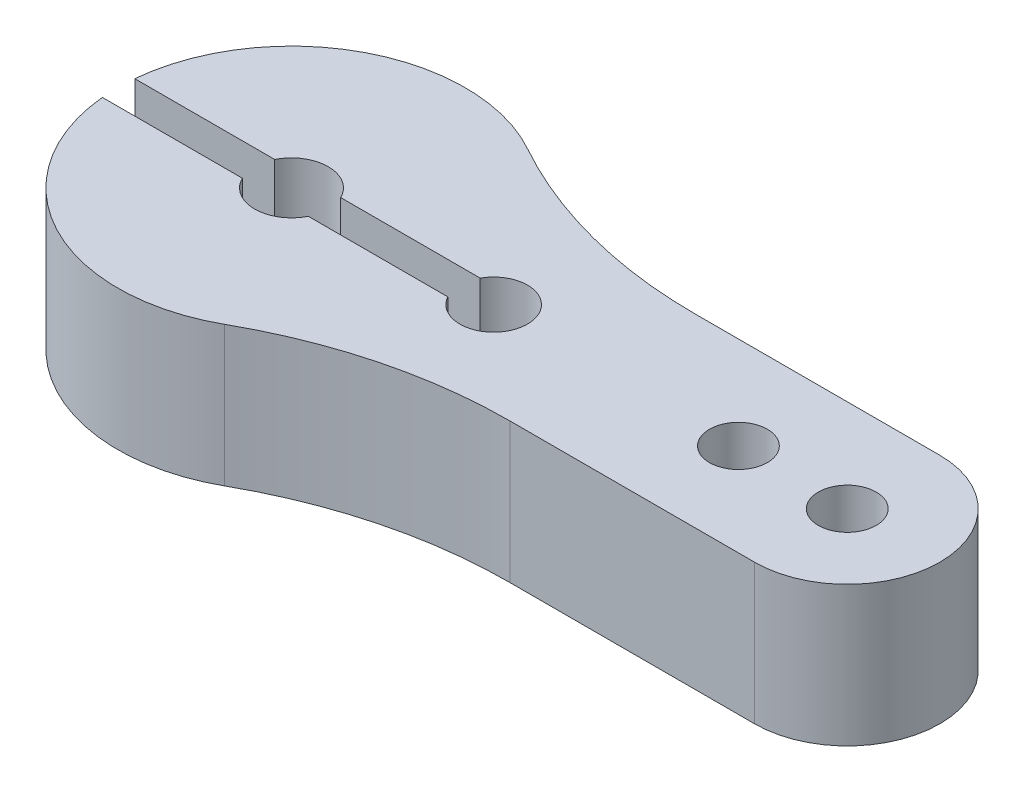
ISO-10303-21;
HEADER;
FILE_DESCRIPTION(('STEP AP214'),'2;1');
FILE_NAME('part.step','',(''),(''),'','','');
FILE_SCHEMA(('AUTOMOTIVE_DESIGN { 1 0 10303 214 1 1 1 1 }'));
ENDSEC;
DATA;
#1=APPLICATION_CONTEXT('core data for automotive mechanical design processes');
#2=APPLICATION_PROTOCOL_DEFINITION('international standard','automotive_design',2000,#1);
#3=PRODUCT_CONTEXT('',#1,'mechanical');
#4=PRODUCT('Part','Part','',(#3));
#5=PRODUCT_RELATED_PRODUCT_CATEGORY('part','',(#4));
#6=PRODUCT_DEFINITION_FORMATION('','',#4);
#7=PRODUCT_DEFINITION_CONTEXT('part definition',#1,'design');
#8=PRODUCT_DEFINITION('design','',#6,#7);
#9=PRODUCT_DEFINITION_SHAPE('','',#8);
#10=(LENGTH_UNIT() NAMED_UNIT(*) SI_UNIT(.MILLI.,.METRE.));
#11=(NAMED_UNIT(*) PLANE_ANGLE_UNIT() SI_UNIT($,.RADIAN.));
#12=(NAMED_UNIT(*) SI_UNIT($,.STERADIAN.) SOLID_ANGLE_UNIT());
#13=UNCERTAINTY_MEASURE_WITH_UNIT(LENGTH_MEASURE(1.E-05),#10,'distance_accuracy_value','');
#14=(GEOMETRIC_REPRESENTATION_CONTEXT(3) GLOBAL_UNCERTAINTY_ASSIGNED_CONTEXT((#13)) GLOBAL_UNIT_ASSIGNED_CONTEXT((#10,
#11,#12)) REPRESENTATION_CONTEXT('',''));
#15=CARTESIAN_POINT('',(0.,0.,0.));
#16=DIRECTION('',(0.,0.,1.));
#17=DIRECTION('',(1.,0.,0.));
#18=AXIS2_PLACEMENT_3D('',#15,#16,#17);
#19=CARTESIAN_POINT('',(0.,6.0452,0.));
#20=DIRECTION('',(0.,-1.,0.));
#21=DIRECTION('',(0.,0.,-1.));
#22=AXIS2_PLACEMENT_3D('',#19,#20,#21);
#23=CYLINDRICAL_SURFACE('',#22,7.5);
#24=CARTESIAN_POINT('',(0.,0.,0.));
#25=DIRECTION('',(0.,1.,0.));
#26=DIRECTION('',(0.,0.,1.));
#27=AXIS2_PLACEMENT_3D('',#24,#25,#26);
#28=CIRCLE('',#27,7.5);
#29=CARTESIAN_POINT('',(3.66156043148115,0.,-6.54545454545455));
#30=VERTEX_POINT('',#29);
#31=CARTESIAN_POINT('',(-7.46726201227719,0.,-0.699998599999998));
#32=VERTEX_POINT('',#31);
#33=EDGE_CURVE('E150',#30,#32,#28,.T.);
#34=ORIENTED_EDGE('',*,*,#33,.T.);
#35=DIRECTION('',(0.,1.,0.));
#36=VECTOR('',#35,1.);
#37=CARTESIAN_POINT('',(-7.46726201227719,-0.00100000000000013,-0.699998599999998));
#38=LINE('',#37,#36);
#39=CARTESIAN_POINT('',(-7.46726201227719,6.0452,-0.699998599999998));
#40=VERTEX_POINT('',#39);
#41=EDGE_CURVE('E134',#32,#40,#38,.T.);
#42=ORIENTED_EDGE('',*,*,#41,.T.);
#43=CARTESIAN_POINT('',(0.,6.0452,0.));
#44=DIRECTION('',(0.,1.,0.));
#45=DIRECTION('',(0.,0.,1.));
#46=AXIS2_PLACEMENT_3D('',#43,#44,#45);
#47=CIRCLE('',#46,7.5);
#48=CARTESIAN_POINT('',(3.66156043148115,6.0452,-6.54545454545455));
#49=VERTEX_POINT('',#48);
#50=EDGE_CURVE('E147',#49,#40,#47,.T.);
#51=ORIENTED_EDGE('',*,*,#50,.F.);
#52=DIRECTION('',(0.,-1.,0.));
#53=VECTOR('',#52,1.);
#54=CARTESIAN_POINT('',(3.66156043148115,6.0452,-6.54545454545455));
#55=LINE('',#54,#53);
#56=EDGE_CURVE('E188',#49,#30,#55,.T.);
#57=ORIENTED_EDGE('',*,*,#56,.T.);
#58=EDGE_LOOP('',(#34,#42,#51,#57));
#59=FACE_BOUND('',#58,.T.);
#60=ADVANCED_FACE('F33',(#59),#23,.T.);
#61=CARTESIAN_POINT('',(0.,-0.00100000000000013,0.));
#62=DIRECTION('',(0.,1.,0.));
#63=DIRECTION('',(0.,0.,1.));
#64=AXIS2_PLACEMENT_3D('',#61,#62,#63);
#65=CYLINDRICAL_SURFACE('',#64,1.5875);
#66=CARTESIAN_POINT('',(0.,6.0452,0.));
#67=DIRECTION('',(0.,1.,0.));
#68=DIRECTION('',(0.,0.,1.));
#69=AXIS2_PLACEMENT_3D('',#66,#67,#68);
#70=CIRCLE('',#69,1.5875);
#71=CARTESIAN_POINT('',(1.42483620462074,6.0452,-0.699998599999999));
#72=VERTEX_POINT('',#71);
#73=CARTESIAN_POINT('',(-1.42483620462074,6.0452,-0.699998599999999));
#74=VERTEX_POINT('',#73);
#75=EDGE_CURVE('E238',#72,#74,#70,.T.);
#76=ORIENTED_EDGE('',*,*,#75,.T.);
#77=DIRECTION('',(0.,1.,0.));
#78=VECTOR('',#77,1.);
#79=CARTESIAN_POINT('',(-1.42483620462074,-0.00100000000000013,-0.699998599999999));
#80=LINE('',#79,#78);
#81=CARTESIAN_POINT('',(-1.42483620462074,0.,-0.699998599999999));
#82=VERTEX_POINT('',#81);
#83=EDGE_CURVE('E135',#82,#74,#80,.T.);
#84=ORIENTED_EDGE('',*,*,#83,.F.);
#85=CARTESIAN_POINT('',(0.,0.,0.));
#86=DIRECTION('',(0.,1.,0.));
#87=DIRECTION('',(0.,0.,1.));
#88=AXIS2_PLACEMENT_3D('',#85,#86,#87);
#89=CIRCLE('',#88,1.5875);
#90=CARTESIAN_POINT('',(1.42483620462074,0.,-0.699998599999999));
#91=VERTEX_POINT('',#90);
#92=EDGE_CURVE('E227',#82,#91,#89,.F.);
#93=ORIENTED_EDGE('',*,*,#92,.T.);
#94=DIRECTION('',(0.,1.,0.));
#95=VECTOR('',#94,1.);
#96=CARTESIAN_POINT('',(1.42483620462074,-0.00100000000000013,-0.699998599999999));
#97=LINE('',#96,#95);
#98=EDGE_CURVE('E250',#72,#91,#97,.F.);
#99=ORIENTED_EDGE('',*,*,#98,.F.);
#100=EDGE_LOOP('',(#76,#84,#93,#99));
#101=FACE_BOUND('',#100,.T.);
#102=ADVANCED_FACE('F284',(#101),#65,.F.);
#103=CARTESIAN_POINT('',(-7.46726174979812,6.0452,0.700001399999999));
#104=VERTEX_POINT('',#103);
#105=CARTESIAN_POINT('',(3.66156043148115,6.0452,6.54545454545455));
#106=VERTEX_POINT('',#105);
#107=EDGE_CURVE('E159',#104,#106,#47,.T.);
#108=ORIENTED_EDGE('',*,*,#107,.F.);
#109=DIRECTION('',(0.,1.,0.));
#110=VECTOR('',#109,1.);
#111=CARTESIAN_POINT('',(-7.46726174979812,-0.00100000000000013,0.700001399999999));
#112=LINE('',#111,#110);
#113=CARTESIAN_POINT('',(-7.46726174979812,0.,0.700001399999999));
#114=VERTEX_POINT('',#113);
#115=EDGE_CURVE('E151',#114,#104,#112,.T.);
#116=ORIENTED_EDGE('',*,*,#115,.F.);
#117=CARTESIAN_POINT('',(3.66156043148115,0.,6.54545454545455));
#118=VERTEX_POINT('',#117);
#119=EDGE_CURVE('E174',#114,#118,#28,.T.);
#120=ORIENTED_EDGE('',*,*,#119,.T.);
#121=DIRECTION('',(0.,-1.,0.));
#122=VECTOR('',#121,1.);
#123=CARTESIAN_POINT('',(3.66156043148115,6.0452,6.54545454545455));
#124=LINE('',#123,#122);
#125=EDGE_CURVE('E185',#118,#106,#124,.F.);
#126=ORIENTED_EDGE('',*,*,#125,.T.);
#127=EDGE_LOOP('',(#108,#116,#120,#126));
#128=FACE_BOUND('',#127,.T.);
#129=ADVANCED_FACE('F211',(#128),#23,.T.);
#130=CARTESIAN_POINT('',(6.34428877022476,6.0452,4.));
#131=DIRECTION('',(0.,0.,-1.));
#132=DIRECTION('',(-1.,0.,0.));
#133=AXIS2_PLACEMENT_3D('',#130,#131,#132);
#134=PLANE('',#133);
#135=DIRECTION('',(1.,0.,0.));
#136=VECTOR('',#135,1.);
#137=CARTESIAN_POINT('',(6.34428877022476,6.0452,4.));
#138=LINE('',#137,#136);
#139=CARTESIAN_POINT('',(13.4257215820975,6.0452,4.));
#140=VERTEX_POINT('',#139);
#141=CARTESIAN_POINT('',(24.,6.0452,4.));
#142=VERTEX_POINT('',#141);
#143=EDGE_CURVE('E158',#140,#142,#138,.T.);
#144=ORIENTED_EDGE('',*,*,#143,.F.);
#145=DIRECTION('',(0.,1.,0.));
#146=VECTOR('',#145,1.);
#147=CARTESIAN_POINT('',(13.4257215820975,0.,4.));
#148=LINE('',#147,#146);
#149=CARTESIAN_POINT('',(13.4257215820975,0.,4.));
#150=VERTEX_POINT('',#149);
#151=EDGE_CURVE('E192',#140,#150,#148,.F.);
#152=ORIENTED_EDGE('',*,*,#151,.T.);
#153=DIRECTION('',(1.,0.,0.));
#154=VECTOR('',#153,1.);
#155=CARTESIAN_POINT('',(6.34428877022476,0.,4.));
#156=LINE('',#155,#154);
#157=CARTESIAN_POINT('',(24.,0.,4.));
#158=VERTEX_POINT('',#157);
#159=EDGE_CURVE('E173',#150,#158,#156,.T.);
#160=ORIENTED_EDGE('',*,*,#159,.T.);
#161=DIRECTION('',(0.,-1.,0.));
#162=VECTOR('',#161,1.);
#163=CARTESIAN_POINT('',(24.,6.0452,4.));
#164=LINE('',#163,#162);
#165=EDGE_CURVE('E182',#142,#158,#164,.T.);
#166=ORIENTED_EDGE('',*,*,#165,.F.);
#167=EDGE_LOOP('',(#144,#152,#160,#166));
#168=FACE_BOUND('',#167,.T.);
#169=ADVANCED_FACE('F302',(#168),#134,.F.);
#170=CARTESIAN_POINT('',(24.,6.0452,0.));
#171=DIRECTION('',(0.,-1.,0.));
#172=DIRECTION('',(0.,0.,-1.));
#173=AXIS2_PLACEMENT_3D('',#170,#171,#172);
#174=CYLINDRICAL_SURFACE('',#173,4.);
#175=CARTESIAN_POINT('',(24.,0.,0.));
#176=DIRECTION('',(0.,1.,0.));
#177=DIRECTION('',(0.,0.,1.));
#178=AXIS2_PLACEMENT_3D('',#175,#176,#177);
#179=CIRCLE('',#178,4.);
#180=CARTESIAN_POINT('',(24.,0.,-4.));
#181=VERTEX_POINT('',#180);
#182=EDGE_CURVE('E176',#158,#181,#179,.T.);
#183=ORIENTED_EDGE('',*,*,#182,.T.);
#184=DIRECTION('',(0.,-1.,0.));
#185=VECTOR('',#184,1.);
#186=CARTESIAN_POINT('',(24.,6.0452,-4.));
#187=LINE('',#186,#185);
#188=CARTESIAN_POINT('',(24.,6.0452,-4.));
#189=VERTEX_POINT('',#188);
#190=EDGE_CURVE('E171',#189,#181,#187,.T.);
#191=ORIENTED_EDGE('',*,*,#190,.F.);
#192=CARTESIAN_POINT('',(24.,6.0452,0.));
#193=DIRECTION('',(0.,1.,0.));
#194=DIRECTION('',(0.,0.,1.));
#195=AXIS2_PLACEMENT_3D('',#192,#193,#194);
#196=CIRCLE('',#195,4.);
#197=EDGE_CURVE('E161',#142,#189,#196,.T.);
#198=ORIENTED_EDGE('',*,*,#197,.F.);
#199=ORIENTED_EDGE('',*,*,#165,.T.);
#200=EDGE_LOOP('',(#183,#191,#198,#199));
#201=FACE_BOUND('',#200,.T.);
#202=ADVANCED_FACE('F306',(#201),#174,.T.);
#203=CARTESIAN_POINT('',(6.34428877022476,6.0452,-4.));
#204=DIRECTION('',(0.,0.,1.));
#205=DIRECTION('',(1.,0.,0.));
#206=AXIS2_PLACEMENT_3D('',#203,#204,#205);
#207=PLANE('',#206);
#208=DIRECTION('',(-1.,0.,0.));
#209=VECTOR('',#208,1.);
#210=CARTESIAN_POINT('',(6.34428877022476,0.,-4.));
#211=LINE('',#210,#209);
#212=CARTESIAN_POINT('',(13.4257215820975,0.,-4.));
#213=VERTEX_POINT('',#212);
#214=EDGE_CURVE('E163',#181,#213,#211,.T.);
#215=ORIENTED_EDGE('',*,*,#214,.T.);
#216=DIRECTION('',(0.,1.,0.));
#217=VECTOR('',#216,1.);
#218=CARTESIAN_POINT('',(13.4257215820975,6.0452,-4.));
#219=LINE('',#218,#217);
#220=CARTESIAN_POINT('',(13.4257215820975,6.0452,-4.));
#221=VERTEX_POINT('',#220);
#222=EDGE_CURVE('E190',#213,#221,#219,.T.);
#223=ORIENTED_EDGE('',*,*,#222,.T.);
#224=DIRECTION('',(-1.,0.,0.));
#225=VECTOR('',#224,1.);
#226=CARTESIAN_POINT('',(6.34428877022476,6.0452,-4.));
#227=LINE('',#226,#225);
#228=EDGE_CURVE('E169',#189,#221,#227,.T.);
#229=ORIENTED_EDGE('',*,*,#228,.F.);
#230=ORIENTED_EDGE('',*,*,#190,.T.);
#231=EDGE_LOOP('',(#215,#223,#229,#230));
#232=FACE_BOUND('',#231,.T.);
#233=ADVANCED_FACE('F311',(#232),#207,.F.);
#234=CARTESIAN_POINT('',(0.,6.0452,0.));
#235=DIRECTION('',(0.,1.,0.));
#236=DIRECTION('',(0.,0.,1.));
#237=AXIS2_PLACEMENT_3D('',#234,#235,#236);
#238=PLANE('',#237);
#239=DIRECTION('',(-1.,0.,0.));
#240=VECTOR('',#239,1.);
#241=CARTESIAN_POINT('',(7.44963844276813,6.0452,-0.6999986));
#242=LINE('',#241,#240);
#243=EDGE_CURVE('E131',#74,#40,#242,.T.);
#244=ORIENTED_EDGE('',*,*,#243,.F.);
#245=ORIENTED_EDGE('',*,*,#75,.F.);
#246=DIRECTION('',(-1.,0.,0.));
#247=VECTOR('',#246,1.);
#248=CARTESIAN_POINT('',(7.44963844276813,6.0452,-0.6999986));
#249=LINE('',#248,#247);
#250=CARTESIAN_POINT('',(7.44963844276813,6.0452,-0.6999986));
#251=VERTEX_POINT('',#250);
#252=EDGE_CURVE('E243',#251,#72,#249,.T.);
#253=ORIENTED_EDGE('',*,*,#252,.F.);
#254=CARTESIAN_POINT('',(8.73145832481008,6.0452,0.));
#255=DIRECTION('',(0.,1.,0.));
#256=DIRECTION('',(0.,0.,1.));
#257=AXIS2_PLACEMENT_3D('',#254,#255,#256);
#258=CIRCLE('',#257,1.4605);
#259=CARTESIAN_POINT('',(7.44963997184503,6.0452,0.7000014));
#260=VERTEX_POINT('',#259);
#261=EDGE_CURVE('E232',#260,#251,#258,.T.);
#262=ORIENTED_EDGE('',*,*,#261,.F.);
#263=DIRECTION('',(1.,0.,0.));
#264=VECTOR('',#263,1.);
#265=CARTESIAN_POINT('',(7.44963997184503,6.0452,0.7000014));
#266=LINE('',#265,#264);
#267=CARTESIAN_POINT('',(1.42483482902336,6.0452,0.700001400000001));
#268=VERTEX_POINT('',#267);
#269=EDGE_CURVE('E245',#268,#260,#266,.T.);
#270=ORIENTED_EDGE('',*,*,#269,.F.);
#271=CARTESIAN_POINT('',(-1.42483482902336,6.0452,0.700001400000001));
#272=VERTEX_POINT('',#271);
#273=EDGE_CURVE('E231',#272,#268,#70,.T.);
#274=ORIENTED_EDGE('',*,*,#273,.F.);
#275=DIRECTION('',(1.,0.,0.));
#276=VECTOR('',#275,1.);
#277=CARTESIAN_POINT('',(7.44963997184503,6.0452,0.7000014));
#278=LINE('',#277,#276);
#279=EDGE_CURVE('E140',#104,#272,#278,.T.);
#280=ORIENTED_EDGE('',*,*,#279,.F.);
#281=ORIENTED_EDGE('',*,*,#107,.T.);
#282=CARTESIAN_POINT('',(13.4257215820975,6.0452,24.));
#283=DIRECTION('',(0.,1.,0.));
#284=DIRECTION('',(0.,0.,1.));
#285=AXIS2_PLACEMENT_3D('',#282,#283,#284);
#286=CIRCLE('',#285,20.);
#287=EDGE_CURVE('E11',#106,#140,#286,.F.);
#288=ORIENTED_EDGE('',*,*,#287,.T.);
#289=ORIENTED_EDGE('',*,*,#143,.T.);
#290=ORIENTED_EDGE('',*,*,#197,.T.);
#291=ORIENTED_EDGE('',*,*,#228,.T.);
#292=CARTESIAN_POINT('',(13.4257215820975,6.0452,-24.));
#293=DIRECTION('',(0.,1.,0.));
#294=DIRECTION('',(0.,0.,1.));
#295=AXIS2_PLACEMENT_3D('',#292,#293,#294);
#296=CIRCLE('',#295,20.);
#297=EDGE_CURVE('E157',#221,#49,#296,.F.);
#298=ORIENTED_EDGE('',*,*,#297,.T.);
#299=ORIENTED_EDGE('',*,*,#50,.T.);
#300=EDGE_LOOP('',(#244,#245,#253,#262,#270,#274,#280,#281,#288,#289,#290,#291,#298,#299));
#301=FACE_BOUND('',#300,.T.);
#302=CARTESIAN_POINT('',(19.301,6.0452,0.));
#303=DIRECTION('',(0.,1.,0.));
#304=DIRECTION('',(0.,0.,1.));
#305=AXIS2_PLACEMENT_3D('',#302,#303,#304);
#306=CIRCLE('',#305,1.24999999999999);
#307=CARTESIAN_POINT('',(19.301,6.0452,1.24999999999999));
#308=VERTEX_POINT('',#307);
#309=EDGE_CURVE('E222',#308,#308,#306,.T.);
#310=ORIENTED_EDGE('',*,*,#309,.F.);
#311=EDGE_LOOP('',(#310));
#312=FACE_BOUND('',#311,.T.);
#313=CARTESIAN_POINT('',(24.,6.0452,0.));
#314=DIRECTION('',(0.,1.,0.));
#315=DIRECTION('',(0.,0.,1.));
#316=AXIS2_PLACEMENT_3D('',#313,#314,#315);
#317=CIRCLE('',#316,1.24999999999999);
#318=CARTESIAN_POINT('',(24.,6.0452,1.24999999999999));
#319=VERTEX_POINT('',#318);
#320=EDGE_CURVE('E214',#319,#319,#317,.T.);
#321=ORIENTED_EDGE('',*,*,#320,.F.);
#322=EDGE_LOOP('',(#321));
#323=FACE_BOUND('',#322,.T.);
#324=ADVANCED_FACE('F153',(#301,#312,#323),#238,.T.);
#325=CARTESIAN_POINT('',(0.,0.,0.));
#326=DIRECTION('',(0.,1.,0.));
#327=DIRECTION('',(0.,0.,1.));
#328=AXIS2_PLACEMENT_3D('',#325,#326,#327);
#329=PLANE('',#328);
#330=CARTESIAN_POINT('',(19.301,0.,0.));
#331=DIRECTION('',(0.,1.,0.));
#332=DIRECTION('',(0.,0.,1.));
#333=AXIS2_PLACEMENT_3D('',#330,#331,#332);
#334=CIRCLE('',#333,1.24999999999999);
#335=CARTESIAN_POINT('',(19.301,0.,1.24999999999999));
#336=VERTEX_POINT('',#335);
#337=EDGE_CURVE('E218',#336,#336,#334,.T.);
#338=ORIENTED_EDGE('',*,*,#337,.T.);
#339=EDGE_LOOP('',(#338));
#340=FACE_BOUND('',#339,.T.);
#341=CARTESIAN_POINT('',(24.,0.,0.));
#342=DIRECTION('',(0.,1.,0.));
#343=DIRECTION('',(0.,0.,1.));
#344=AXIS2_PLACEMENT_3D('',#341,#342,#343);
#345=CIRCLE('',#344,1.24999999999999);
#346=CARTESIAN_POINT('',(24.,0.,1.24999999999999));
#347=VERTEX_POINT('',#346);
#348=EDGE_CURVE('E165',#347,#347,#345,.T.);
#349=ORIENTED_EDGE('',*,*,#348,.T.);
#350=EDGE_LOOP('',(#349));
#351=FACE_BOUND('',#350,.T.);
#352=ORIENTED_EDGE('',*,*,#92,.F.);
#353=DIRECTION('',(1.,0.,0.));
#354=VECTOR('',#353,1.);
#355=CARTESIAN_POINT('',(7.44963844276813,0.,-0.6999986));
#356=LINE('',#355,#354);
#357=EDGE_CURVE('E56',#32,#82,#356,.T.);
#358=ORIENTED_EDGE('',*,*,#357,.F.);
#359=ORIENTED_EDGE('',*,*,#33,.F.);
#360=CARTESIAN_POINT('',(13.4257215820975,0.,-24.));
#361=DIRECTION('',(0.,1.,0.));
#362=DIRECTION('',(0.,0.,1.));
#363=AXIS2_PLACEMENT_3D('',#360,#361,#362);
#364=CIRCLE('',#363,20.);
#365=EDGE_CURVE('E195',#30,#213,#364,.T.);
#366=ORIENTED_EDGE('',*,*,#365,.T.);
#367=ORIENTED_EDGE('',*,*,#214,.F.);
#368=ORIENTED_EDGE('',*,*,#182,.F.);
#369=ORIENTED_EDGE('',*,*,#159,.F.);
#370=CARTESIAN_POINT('',(13.4257215820975,0.,24.));
#371=DIRECTION('',(0.,1.,0.));
#372=DIRECTION('',(0.,0.,1.));
#373=AXIS2_PLACEMENT_3D('',#370,#371,#372);
#374=CIRCLE('',#373,20.);
#375=EDGE_CURVE('E41',#150,#118,#374,.T.);
#376=ORIENTED_EDGE('',*,*,#375,.T.);
#377=ORIENTED_EDGE('',*,*,#119,.F.);
#378=DIRECTION('',(-1.,0.,0.));
#379=VECTOR('',#378,1.);
#380=CARTESIAN_POINT('',(7.44963997184503,0.,0.7000014));
#381=LINE('',#380,#379);
#382=CARTESIAN_POINT('',(-1.42483482902336,0.,0.700001400000001));
#383=VERTEX_POINT('',#382);
#384=EDGE_CURVE('E141',#383,#114,#381,.T.);
#385=ORIENTED_EDGE('',*,*,#384,.F.);
#386=CARTESIAN_POINT('',(1.42483482902336,0.,0.700001400000001));
#387=VERTEX_POINT('',#386);
#388=EDGE_CURVE('E235',#387,#383,#89,.F.);
#389=ORIENTED_EDGE('',*,*,#388,.F.);
#390=DIRECTION('',(-1.,0.,0.));
#391=VECTOR('',#390,1.);
#392=CARTESIAN_POINT('',(7.44963997184503,0.,0.7000014));
#393=LINE('',#392,#391);
#394=CARTESIAN_POINT('',(7.44963997184503,0.,0.7000014));
#395=VERTEX_POINT('',#394);
#396=EDGE_CURVE('E48',#395,#387,#393,.T.);
#397=ORIENTED_EDGE('',*,*,#396,.F.);
#398=CARTESIAN_POINT('',(8.73145832481008,0.,0.));
#399=DIRECTION('',(0.,1.,0.));
#400=DIRECTION('',(0.,0.,1.));
#401=AXIS2_PLACEMENT_3D('',#398,#399,#400);
#402=CIRCLE('',#401,1.4605);
#403=CARTESIAN_POINT('',(7.44963844276813,0.,-0.6999986));
#404=VERTEX_POINT('',#403);
#405=EDGE_CURVE('E228',#404,#395,#402,.F.);
#406=ORIENTED_EDGE('',*,*,#405,.F.);
#407=DIRECTION('',(1.,0.,0.));
#408=VECTOR('',#407,1.);
#409=CARTESIAN_POINT('',(7.44963844276813,0.,-0.6999986));
#410=LINE('',#409,#408);
#411=EDGE_CURVE('E242',#91,#404,#410,.T.);
#412=ORIENTED_EDGE('',*,*,#411,.F.);
#413=EDGE_LOOP('',(#352,#358,#359,#366,#367,#368,#369,#376,#377,#385,#389,#397,#406,#412));
#414=FACE_BOUND('',#413,.T.);
#415=ADVANCED_FACE('F203',(#340,#351,#414),#329,.F.);
#416=CARTESIAN_POINT('',(13.4257215820975,6.0452,-24.));
#417=DIRECTION('',(0.,-1.,0.));
#418=DIRECTION('',(0.,0.,-1.));
#419=AXIS2_PLACEMENT_3D('',#416,#417,#418);
#420=CYLINDRICAL_SURFACE('',#419,20.);
#421=ORIENTED_EDGE('',*,*,#297,.F.);
#422=ORIENTED_EDGE('',*,*,#222,.F.);
#423=ORIENTED_EDGE('',*,*,#365,.F.);
#424=ORIENTED_EDGE('',*,*,#56,.F.);
#425=EDGE_LOOP('',(#421,#422,#423,#424));
#426=FACE_BOUND('',#425,.T.);
#427=ADVANCED_FACE('F321',(#426),#420,.F.);
#428=CARTESIAN_POINT('',(13.4257215820975,6.0452,24.));
#429=DIRECTION('',(0.,-1.,0.));
#430=DIRECTION('',(0.,0.,-1.));
#431=AXIS2_PLACEMENT_3D('',#428,#429,#430);
#432=CYLINDRICAL_SURFACE('',#431,20.);
#433=ORIENTED_EDGE('',*,*,#287,.F.);
#434=ORIENTED_EDGE('',*,*,#125,.F.);
#435=ORIENTED_EDGE('',*,*,#375,.F.);
#436=ORIENTED_EDGE('',*,*,#151,.F.);
#437=EDGE_LOOP('',(#433,#434,#435,#436));
#438=FACE_BOUND('',#437,.T.);
#439=ADVANCED_FACE('F35',(#438),#432,.F.);
#440=CARTESIAN_POINT('',(24.,6.0452,0.));
#441=DIRECTION('',(0.,1.,0.));
#442=DIRECTION('',(0.,0.,1.));
#443=AXIS2_PLACEMENT_3D('',#440,#441,#442);
#444=CYLINDRICAL_SURFACE('',#443,1.24999999999999);
#445=ORIENTED_EDGE('',*,*,#348,.F.);
#446=EDGE_LOOP('',(#445));
#447=FACE_BOUND('',#446,.T.);
#448=ORIENTED_EDGE('',*,*,#320,.T.);
#449=EDGE_LOOP('',(#448));
#450=FACE_BOUND('',#449,.T.);
#451=ADVANCED_FACE('F325',(#447,#450),#444,.F.);
#452=CARTESIAN_POINT('',(19.301,6.0452,0.));
#453=DIRECTION('',(0.,1.,0.));
#454=DIRECTION('',(0.,0.,1.));
#455=AXIS2_PLACEMENT_3D('',#452,#453,#454);
#456=CYLINDRICAL_SURFACE('',#455,1.24999999999999);
#457=ORIENTED_EDGE('',*,*,#337,.F.);
#458=EDGE_LOOP('',(#457));
#459=FACE_BOUND('',#458,.T.);
#460=ORIENTED_EDGE('',*,*,#309,.T.);
#461=EDGE_LOOP('',(#460));
#462=FACE_BOUND('',#461,.T.);
#463=ADVANCED_FACE('F328',(#459,#462),#456,.F.);
#464=CARTESIAN_POINT('',(8.73145832481008,-0.00100000000000013,0.));
#465=DIRECTION('',(0.,1.,0.));
#466=DIRECTION('',(0.,0.,1.));
#467=AXIS2_PLACEMENT_3D('',#464,#465,#466);
#468=CYLINDRICAL_SURFACE('',#467,1.4605);
#469=ORIENTED_EDGE('',*,*,#405,.T.);
#470=DIRECTION('',(0.,1.,0.));
#471=VECTOR('',#470,1.);
#472=CARTESIAN_POINT('',(7.44963997184503,-0.00100000000000013,0.7000014));
#473=LINE('',#472,#471);
#474=EDGE_CURVE('E247',#395,#260,#473,.T.);
#475=ORIENTED_EDGE('',*,*,#474,.T.);
#476=ORIENTED_EDGE('',*,*,#261,.T.);
#477=DIRECTION('',(0.,1.,0.));
#478=VECTOR('',#477,1.);
#479=CARTESIAN_POINT('',(7.44963844276813,-0.00100000000000013,-0.6999986));
#480=LINE('',#479,#478);
#481=EDGE_CURVE('E252',#404,#251,#480,.T.);
#482=ORIENTED_EDGE('',*,*,#481,.F.);
#483=EDGE_LOOP('',(#469,#475,#476,#482));
#484=FACE_BOUND('',#483,.T.);
#485=ADVANCED_FACE('F277',(#484),#468,.F.);
#486=ORIENTED_EDGE('',*,*,#388,.T.);
#487=DIRECTION('',(0.,1.,0.));
#488=VECTOR('',#487,1.);
#489=CARTESIAN_POINT('',(-1.42483482902336,-0.00100000000000013,0.700001400000001));
#490=LINE('',#489,#488);
#491=EDGE_CURVE('E261',#272,#383,#490,.F.);
#492=ORIENTED_EDGE('',*,*,#491,.F.);
#493=ORIENTED_EDGE('',*,*,#273,.T.);
#494=DIRECTION('',(0.,1.,0.));
#495=VECTOR('',#494,1.);
#496=CARTESIAN_POINT('',(1.42483482902336,-0.00100000000000013,0.700001400000001));
#497=LINE('',#496,#495);
#498=EDGE_CURVE('E249',#387,#268,#497,.T.);
#499=ORIENTED_EDGE('',*,*,#498,.F.);
#500=EDGE_LOOP('',(#486,#492,#493,#499));
#501=FACE_BOUND('',#500,.T.);
#502=ADVANCED_FACE('F270',(#501),#65,.F.);
#503=CARTESIAN_POINT('',(7.44963844276813,-0.00100000000000013,-0.6999986));
#504=DIRECTION('',(0.,0.,-1.));
#505=DIRECTION('',(-1.,0.,0.));
#506=AXIS2_PLACEMENT_3D('',#503,#504,#505);
#507=PLANE('',#506);
#508=ORIENTED_EDGE('',*,*,#411,.T.);
#509=ORIENTED_EDGE('',*,*,#481,.T.);
#510=ORIENTED_EDGE('',*,*,#252,.T.);
#511=ORIENTED_EDGE('',*,*,#98,.T.);
#512=EDGE_LOOP('',(#508,#509,#510,#511));
#513=FACE_BOUND('',#512,.T.);
#514=ADVANCED_FACE('F285',(#513),#507,.F.);
#515=CARTESIAN_POINT('',(7.44963997184503,-0.00100000000000013,0.7000014));
#516=DIRECTION('',(0.,0.,1.));
#517=DIRECTION('',(1.,0.,0.));
#518=AXIS2_PLACEMENT_3D('',#515,#516,#517);
#519=PLANE('',#518);
#520=ORIENTED_EDGE('',*,*,#396,.T.);
#521=ORIENTED_EDGE('',*,*,#498,.T.);
#522=ORIENTED_EDGE('',*,*,#269,.T.);
#523=ORIENTED_EDGE('',*,*,#474,.F.);
#524=EDGE_LOOP('',(#520,#521,#522,#523));
#525=FACE_BOUND('',#524,.T.);
#526=ADVANCED_FACE('F272',(#525),#519,.F.);
#527=CARTESIAN_POINT('',(7.44963997184503,-0.00100000000000013,0.7000014));
#528=DIRECTION('',(0.,0.,1.));
#529=DIRECTION('',(1.,0.,0.));
#530=AXIS2_PLACEMENT_3D('',#527,#528,#529);
#531=PLANE('',#530);
#532=ORIENTED_EDGE('',*,*,#384,.T.);
#533=ORIENTED_EDGE('',*,*,#115,.T.);
#534=ORIENTED_EDGE('',*,*,#279,.T.);
#535=ORIENTED_EDGE('',*,*,#491,.T.);
#536=EDGE_LOOP('',(#532,#533,#534,#535));
#537=FACE_BOUND('',#536,.T.);
#538=ADVANCED_FACE('F265',(#537),#531,.F.);
#539=CARTESIAN_POINT('',(7.44963844276813,-0.00100000000000013,-0.6999986));
#540=DIRECTION('',(0.,0.,-1.));
#541=DIRECTION('',(-1.,0.,0.));
#542=AXIS2_PLACEMENT_3D('',#539,#540,#541);
#543=PLANE('',#542);
#544=ORIENTED_EDGE('',*,*,#357,.T.);
#545=ORIENTED_EDGE('',*,*,#83,.T.);
#546=ORIENTED_EDGE('',*,*,#243,.T.);
#547=ORIENTED_EDGE('',*,*,#41,.F.);
#548=EDGE_LOOP('',(#544,#545,#546,#547));
#549=FACE_BOUND('',#548,.T.);
#550=ADVANCED_FACE('F133',(#549),#543,.F.);
#551=CLOSED_SHELL('',(#60,#102,#129,#169,#202,#233,#324,#415,#427,#439,#451,#463,#485,#502,#514,
#526,#538,#550));
#552=MANIFOLD_SOLID_BREP('B2',#551);
#553=ADVANCED_BREP_SHAPE_REPRESENTATION('',(#18,#552),#14);
#554=SHAPE_DEFINITION_REPRESENTATION(#9,#553);
ENDSEC;
END-ISO-10303-21;
